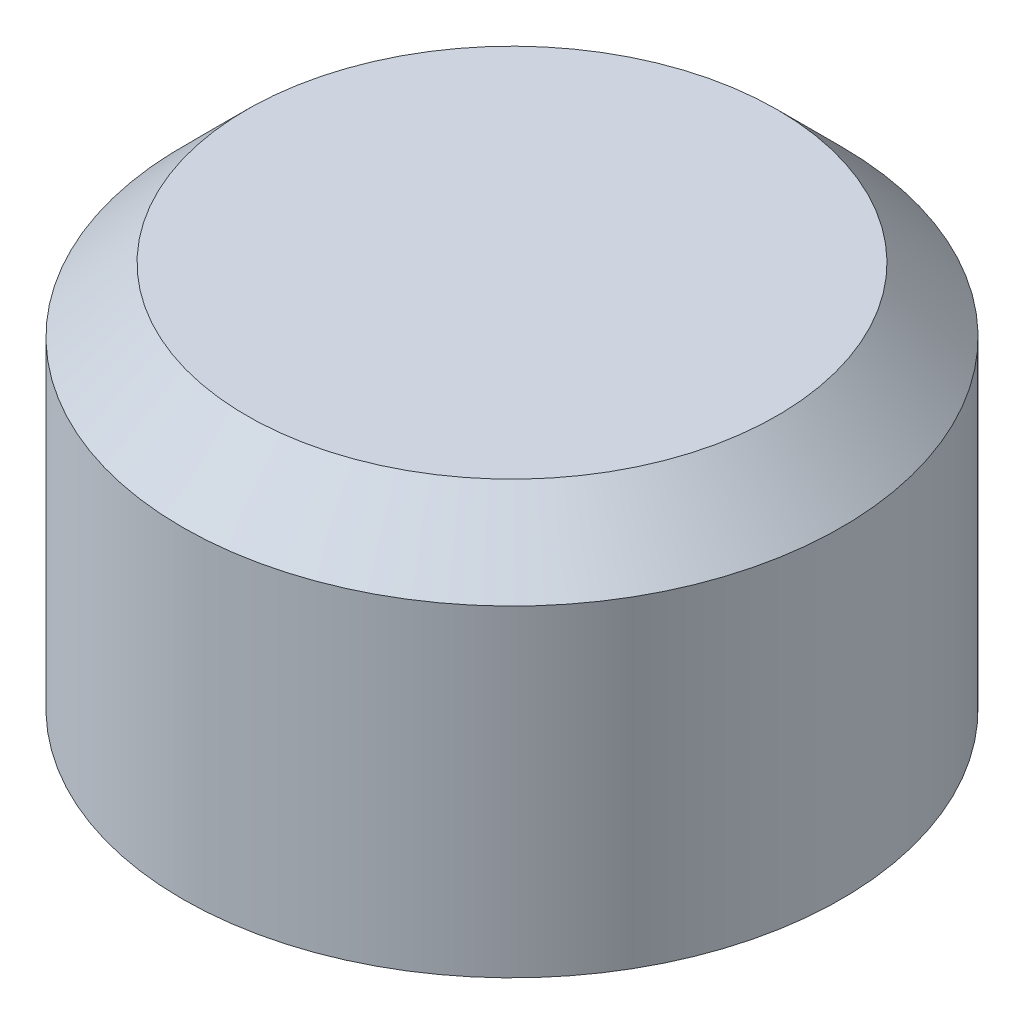
ISO-10303-21;
HEADER;
FILE_DESCRIPTION(('STEP AP214'),'2;1');
FILE_NAME('part.step','',(''),(''),'','','');
FILE_SCHEMA(('AUTOMOTIVE_DESIGN { 1 0 10303 214 1 1 1 1 }'));
ENDSEC;
DATA;
#1=APPLICATION_CONTEXT('core data for automotive mechanical design processes');
#2=APPLICATION_PROTOCOL_DEFINITION('international standard','automotive_design',2000,#1);
#3=PRODUCT_CONTEXT('',#1,'mechanical');
#4=PRODUCT('Part','Part','',(#3));
#5=PRODUCT_RELATED_PRODUCT_CATEGORY('part','',(#4));
#6=PRODUCT_DEFINITION_FORMATION('','',#4);
#7=PRODUCT_DEFINITION_CONTEXT('part definition',#1,'design');
#8=PRODUCT_DEFINITION('design','',#6,#7);
#9=PRODUCT_DEFINITION_SHAPE('','',#8);
#10=(LENGTH_UNIT() NAMED_UNIT(*) SI_UNIT(.MILLI.,.METRE.));
#11=(NAMED_UNIT(*) PLANE_ANGLE_UNIT() SI_UNIT($,.RADIAN.));
#12=(NAMED_UNIT(*) SI_UNIT($,.STERADIAN.) SOLID_ANGLE_UNIT());
#13=UNCERTAINTY_MEASURE_WITH_UNIT(LENGTH_MEASURE(1.E-05),#10,'distance_accuracy_value','');
#14=(GEOMETRIC_REPRESENTATION_CONTEXT(3) GLOBAL_UNCERTAINTY_ASSIGNED_CONTEXT((#13)) GLOBAL_UNIT_ASSIGNED_CONTEXT((#10,
#11,#12)) REPRESENTATION_CONTEXT('',''));
#15=CARTESIAN_POINT('',(0.,0.,0.));
#16=DIRECTION('',(0.,0.,1.));
#17=DIRECTION('',(1.,0.,0.));
#18=AXIS2_PLACEMENT_3D('',#15,#16,#17);
#19=CARTESIAN_POINT('',(0.,7.62,0.));
#20=DIRECTION('',(0.,-1.,0.));
#21=DIRECTION('',(0.,0.,-1.));
#22=AXIS2_PLACEMENT_3D('',#19,#20,#21);
#23=CYLINDRICAL_SURFACE('',#22,6.4999997);
#24=CARTESIAN_POINT('',(0.,6.35000000000001,0.));
#25=DIRECTION('',(0.,1.,0.));
#26=DIRECTION('',(0.,0.,1.));
#27=AXIS2_PLACEMENT_3D('',#24,#25,#26);
#28=CIRCLE('',#27,6.4999997);
#29=CARTESIAN_POINT('',(0.,6.35000000000001,-6.4999997));
#30=VERTEX_POINT('',#29);
#31=EDGE_CURVE('E10',#30,#30,#28,.F.);
#32=CARTESIAN_POINT('',(0.,0.,0.));
#33=DIRECTION('',(0.,1.,0.));
#34=DIRECTION('',(0.,0.,1.));
#35=AXIS2_PLACEMENT_3D('',#32,#33,#34);
#36=CIRCLE('',#35,6.4999997);
#37=CARTESIAN_POINT('',(0.,0.,-6.4999997));
#38=VERTEX_POINT('',#37);
#39=EDGE_CURVE('E42',#38,#38,#36,.T.);
#40=CARTESIAN_POINT('',(0.,6.35000000000001,-6.4999997));
#41=CARTESIAN_POINT('',(0.,6.28385416666667,-6.4999997));
#42=CARTESIAN_POINT('',(0.,6.21770833333334,-6.4999997));
#43=CARTESIAN_POINT('',(0.,6.08541666666667,-6.4999997));
#44=CARTESIAN_POINT('',(0.,6.01927083333334,-6.4999997));
#45=CARTESIAN_POINT('',(0.,5.88697916666667,-6.4999997));
#46=CARTESIAN_POINT('',(0.,5.82083333333334,-6.4999997));
#47=CARTESIAN_POINT('',(0.,5.68854166666667,-6.4999997));
#48=CARTESIAN_POINT('',(0.,5.62239583333334,-6.4999997));
#49=CARTESIAN_POINT('',(0.,5.49010416666667,-6.4999997));
#50=CARTESIAN_POINT('',(0.,5.42395833333334,-6.4999997));
#51=CARTESIAN_POINT('',(0.,5.29166666666667,-6.4999997));
#52=CARTESIAN_POINT('',(0.,5.22552083333334,-6.4999997));
#53=CARTESIAN_POINT('',(0.,5.09322916666667,-6.4999997));
#54=CARTESIAN_POINT('',(0.,5.02708333333334,-6.4999997));
#55=CARTESIAN_POINT('',(0.,4.89479166666667,-6.4999997));
#56=CARTESIAN_POINT('',(0.,4.82864583333334,-6.4999997));
#57=CARTESIAN_POINT('',(0.,4.69635416666667,-6.4999997));
#58=CARTESIAN_POINT('',(0.,4.63020833333334,-6.4999997));
#59=CARTESIAN_POINT('',(0.,4.49791666666667,-6.4999997));
#60=CARTESIAN_POINT('',(0.,4.43177083333334,-6.4999997));
#61=CARTESIAN_POINT('',(0.,4.29947916666667,-6.4999997));
#62=CARTESIAN_POINT('',(0.,4.23333333333334,-6.4999997));
#63=CARTESIAN_POINT('',(0.,4.10104166666667,-6.4999997));
#64=CARTESIAN_POINT('',(0.,4.03489583333334,-6.4999997));
#65=CARTESIAN_POINT('',(0.,3.90260416666667,-6.4999997));
#66=CARTESIAN_POINT('',(0.,3.83645833333334,-6.4999997));
#67=CARTESIAN_POINT('',(0.,3.70416666666667,-6.4999997));
#68=CARTESIAN_POINT('',(0.,3.63802083333334,-6.4999997));
#69=CARTESIAN_POINT('',(0.,3.50572916666667,-6.4999997));
#70=CARTESIAN_POINT('',(0.,3.43958333333334,-6.4999997));
#71=CARTESIAN_POINT('',(0.,3.30729166666667,-6.4999997));
#72=CARTESIAN_POINT('',(0.,3.24114583333334,-6.4999997));
#73=CARTESIAN_POINT('',(0.,3.10885416666667,-6.4999997));
#74=CARTESIAN_POINT('',(0.,3.04270833333334,-6.4999997));
#75=CARTESIAN_POINT('',(0.,2.91041666666667,-6.4999997));
#76=CARTESIAN_POINT('',(0.,2.84427083333334,-6.4999997));
#77=CARTESIAN_POINT('',(0.,2.71197916666667,-6.4999997));
#78=CARTESIAN_POINT('',(0.,2.64583333333334,-6.4999997));
#79=CARTESIAN_POINT('',(0.,2.51354166666667,-6.4999997));
#80=CARTESIAN_POINT('',(0.,2.44739583333334,-6.4999997));
#81=CARTESIAN_POINT('',(0.,2.31510416666667,-6.4999997));
#82=CARTESIAN_POINT('',(0.,2.24895833333334,-6.4999997));
#83=CARTESIAN_POINT('',(0.,2.11666666666667,-6.4999997));
#84=CARTESIAN_POINT('',(0.,2.05052083333334,-6.4999997));
#85=CARTESIAN_POINT('',(0.,1.91822916666667,-6.4999997));
#86=CARTESIAN_POINT('',(0.,1.85208333333334,-6.4999997));
#87=CARTESIAN_POINT('',(0.,1.71979166666667,-6.4999997));
#88=CARTESIAN_POINT('',(0.,1.65364583333334,-6.4999997));
#89=CARTESIAN_POINT('',(0.,1.52135416666667,-6.4999997));
#90=CARTESIAN_POINT('',(0.,1.45520833333333,-6.4999997));
#91=CARTESIAN_POINT('',(0.,1.32291666666667,-6.4999997));
#92=CARTESIAN_POINT('',(0.,1.25677083333333,-6.4999997));
#93=CARTESIAN_POINT('',(0.,1.12447916666667,-6.4999997));
#94=CARTESIAN_POINT('',(0.,1.05833333333333,-6.4999997));
#95=CARTESIAN_POINT('',(0.,0.926041666666668,-6.4999997));
#96=CARTESIAN_POINT('',(0.,0.859895833333335,-6.4999997));
#97=CARTESIAN_POINT('',(0.,0.727604166666667,-6.4999997));
#98=CARTESIAN_POINT('',(0.,0.661458333333334,-6.4999997));
#99=CARTESIAN_POINT('',(0.,0.529166666666667,-6.4999997));
#100=CARTESIAN_POINT('',(0.,0.463020833333333,-6.4999997));
#101=CARTESIAN_POINT('',(0.,0.330729166666667,-6.4999997));
#102=CARTESIAN_POINT('',(0.,0.264583333333334,-6.4999997));
#103=CARTESIAN_POINT('',(0.,0.132291666666667,-6.4999997));
#104=CARTESIAN_POINT('',(0.,0.0661458333333335,-6.4999997));
#105=CARTESIAN_POINT('',(0.,0.,-6.4999997));
#106=B_SPLINE_CURVE_WITH_KNOTS('',3,(#40,#41,#42,#43,#44,#45,#46,#47,#48,#49,#50,#51,#52,#53,
#54,#55,#56,#57,#58,#59,#60,#61,#62,#63,#64,#65,#66,#67,#68,#69,#70,#71,#72,#73,#74,#75,#76,#77,
#78,#79,#80,#81,#82,#83,#84,#85,#86,#87,#88,#89,#90,#91,#92,#93,#94,#95,#96,#97,#98,#99,#100,
#101,#102,#103,#104,#105),.UNSPECIFIED.,.F.,.F.,(4,2,2,2,2,2,2,2,2,2,2,2,2,2,2,2,2,2,2,2,2,2,2,
2,2,2,2,2,2,2,2,2,4),(0.,0.198437500000001,0.396875000000001,0.595312500000001,
0.793750000000001,0.992187500000001,1.190625,1.3890625,1.5875,1.7859375,1.984375,2.1828125,
2.38125,2.5796875,2.778125,2.9765625,3.175,3.3734375,3.571875,3.7703125,3.96875,
4.16718750000001,4.36562500000001,4.5640625,4.76250000000001,4.96093750000001,5.15937500000001,
5.35781250000001,5.55625000000001,5.75468750000001,5.95312500000001,6.15156250000001,
6.35000000000001),.UNSPECIFIED.);
#107=EDGE_CURVE('BSEAM31',#30,#38,#106,.T.);
#108=ORIENTED_EDGE('',*,*,#31,.T.);
#109=ORIENTED_EDGE('',*,*,#39,.T.);
#110=ORIENTED_EDGE('',*,*,#107,.T.);
#111=ORIENTED_EDGE('',*,*,#107,.F.);
#112=EDGE_LOOP('',(#108,#110,#109,#111));
#113=FACE_BOUND('',#112,.T.);
#114=ADVANCED_FACE('F31',(#113),#23,.T.);
#115=CARTESIAN_POINT('',(0.,7.62,0.));
#116=DIRECTION('',(0.,1.,0.));
#117=DIRECTION('',(0.,0.,1.));
#118=AXIS2_PLACEMENT_3D('',#115,#116,#117);
#119=PLANE('',#118);
#120=CARTESIAN_POINT('',(0.,7.62,0.));
#121=DIRECTION('',(0.,1.,0.));
#122=DIRECTION('',(0.,0.,1.));
#123=AXIS2_PLACEMENT_3D('',#120,#121,#122);
#124=CIRCLE('',#123,5.22999970000001);
#125=CARTESIAN_POINT('',(0.,7.62,-5.22999970000001));
#126=VERTEX_POINT('',#125);
#127=EDGE_CURVE('E38',#126,#126,#124,.T.);
#128=ORIENTED_EDGE('',*,*,#127,.T.);
#129=EDGE_LOOP('',(#128));
#130=FACE_BOUND('',#129,.T.);
#131=ADVANCED_FACE('F52',(#130),#119,.T.);
#132=CARTESIAN_POINT('',(0.,0.,0.));
#133=DIRECTION('',(0.,1.,0.));
#134=DIRECTION('',(0.,0.,1.));
#135=AXIS2_PLACEMENT_3D('',#132,#133,#134);
#136=PLANE('',#135);
#137=ORIENTED_EDGE('',*,*,#39,.F.);
#138=EDGE_LOOP('',(#137));
#139=FACE_BOUND('',#138,.T.);
#140=ADVANCED_FACE('F50',(#139),#136,.F.);
#141=CARTESIAN_POINT('',(0.,7.62,0.));
#142=DIRECTION('',(0.,-1.,0.));
#143=DIRECTION('',(0.,0.,-1.));
#144=AXIS2_PLACEMENT_3D('',#141,#142,#143);
#145=CONICAL_SURFACE('',#144,5.22999970000001,0.785398163397448);
#146=CARTESIAN_POINT('',(0.,6.35000000000001,-6.4999997));
#147=CARTESIAN_POINT('',(0.,6.36322916666667,-6.48677053333333));
#148=CARTESIAN_POINT('',(0.,6.37645833333334,-6.47354136666667));
#149=CARTESIAN_POINT('',(0.,6.40291666666667,-6.44708303333334));
#150=CARTESIAN_POINT('',(0.,6.41614583333334,-6.43385386666667));
#151=CARTESIAN_POINT('',(0.,6.44260416666667,-6.40739553333334));
#152=CARTESIAN_POINT('',(0.,6.45583333333334,-6.39416636666667));
#153=CARTESIAN_POINT('',(0.,6.48229166666667,-6.36770803333334));
#154=CARTESIAN_POINT('',(0.,6.49552083333334,-6.35447886666667));
#155=CARTESIAN_POINT('',(0.,6.52197916666667,-6.32802053333334));
#156=CARTESIAN_POINT('',(0.,6.53520833333334,-6.31479136666667));
#157=CARTESIAN_POINT('',(0.,6.56166666666667,-6.28833303333334));
#158=CARTESIAN_POINT('',(0.,6.57489583333334,-6.27510386666667));
#159=CARTESIAN_POINT('',(0.,6.60135416666667,-6.24864553333334));
#160=CARTESIAN_POINT('',(0.,6.61458333333334,-6.23541636666667));
#161=CARTESIAN_POINT('',(0.,6.64104166666667,-6.20895803333334));
#162=CARTESIAN_POINT('',(0.,6.65427083333334,-6.19572886666667));
#163=CARTESIAN_POINT('',(0.,6.68072916666667,-6.16927053333334));
#164=CARTESIAN_POINT('',(0.,6.69395833333334,-6.15604136666667));
#165=CARTESIAN_POINT('',(0.,6.72041666666667,-6.12958303333334));
#166=CARTESIAN_POINT('',(0.,6.73364583333334,-6.11635386666667));
#167=CARTESIAN_POINT('',(0.,6.76010416666667,-6.08989553333334));
#168=CARTESIAN_POINT('',(0.,6.77333333333334,-6.07666636666667));
#169=CARTESIAN_POINT('',(0.,6.79979166666667,-6.05020803333334));
#170=CARTESIAN_POINT('',(0.,6.81302083333334,-6.03697886666667));
#171=CARTESIAN_POINT('',(0.,6.83947916666667,-6.01052053333334));
#172=CARTESIAN_POINT('',(0.,6.85270833333334,-5.99729136666667));
#173=CARTESIAN_POINT('',(0.,6.87916666666667,-5.97083303333334));
#174=CARTESIAN_POINT('',(0.,6.89239583333334,-5.95760386666667));
#175=CARTESIAN_POINT('',(0.,6.91885416666667,-5.93114553333334));
#176=CARTESIAN_POINT('',(0.,6.93208333333334,-5.91791636666667));
#177=CARTESIAN_POINT('',(0.,6.95854166666667,-5.89145803333334));
#178=CARTESIAN_POINT('',(0.,6.97177083333334,-5.87822886666667));
#179=CARTESIAN_POINT('',(0.,6.99822916666667,-5.85177053333334));
#180=CARTESIAN_POINT('',(0.,7.01145833333334,-5.83854136666667));
#181=CARTESIAN_POINT('',(0.,7.03791666666667,-5.81208303333334));
#182=CARTESIAN_POINT('',(0.,7.05114583333334,-5.79885386666667));
#183=CARTESIAN_POINT('',(0.,7.07760416666667,-5.77239553333334));
#184=CARTESIAN_POINT('',(0.,7.09083333333334,-5.75916636666667));
#185=CARTESIAN_POINT('',(0.,7.11729166666667,-5.73270803333334));
#186=CARTESIAN_POINT('',(0.,7.13052083333334,-5.71947886666667));
#187=CARTESIAN_POINT('',(0.,7.15697916666667,-5.69302053333334));
#188=CARTESIAN_POINT('',(0.,7.17020833333333,-5.67979136666667));
#189=CARTESIAN_POINT('',(0.,7.19666666666667,-5.65333303333334));
#190=CARTESIAN_POINT('',(0.,7.20989583333333,-5.64010386666667));
#191=CARTESIAN_POINT('',(0.,7.23635416666667,-5.61364553333334));
#192=CARTESIAN_POINT('',(0.,7.24958333333333,-5.60041636666667));
#193=CARTESIAN_POINT('',(0.,7.27604166666667,-5.57395803333334));
#194=CARTESIAN_POINT('',(0.,7.28927083333333,-5.56072886666668));
#195=CARTESIAN_POINT('',(0.,7.31572916666667,-5.53427053333334));
#196=CARTESIAN_POINT('',(0.,7.32895833333333,-5.52104136666668));
#197=CARTESIAN_POINT('',(0.,7.35541666666667,-5.49458303333334));
#198=CARTESIAN_POINT('',(0.,7.36864583333333,-5.48135386666668));
#199=CARTESIAN_POINT('',(0.,7.39510416666667,-5.45489553333334));
#200=CARTESIAN_POINT('',(0.,7.40833333333333,-5.44166636666668));
#201=CARTESIAN_POINT('',(0.,7.43479166666667,-5.41520803333334));
#202=CARTESIAN_POINT('',(0.,7.44802083333333,-5.40197886666668));
#203=CARTESIAN_POINT('',(0.,7.47447916666667,-5.37552053333334));
#204=CARTESIAN_POINT('',(0.,7.48770833333333,-5.36229136666668));
#205=CARTESIAN_POINT('',(0.,7.51416666666667,-5.33583303333334));
#206=CARTESIAN_POINT('',(0.,7.52739583333333,-5.32260386666668));
#207=CARTESIAN_POINT('',(0.,7.55385416666667,-5.29614553333334));
#208=CARTESIAN_POINT('',(0.,7.56708333333333,-5.28291636666668));
#209=CARTESIAN_POINT('',(0.,7.59354166666667,-5.25645803333334));
#210=CARTESIAN_POINT('',(0.,7.60677083333333,-5.24322886666668));
#211=CARTESIAN_POINT('',(0.,7.62,-5.22999970000001));
#212=B_SPLINE_CURVE_WITH_KNOTS('',3,(#146,#147,#148,#149,#150,#151,#152,#153,#154,#155,#156,
#157,#158,#159,#160,#161,#162,#163,#164,#165,#166,#167,#168,#169,#170,#171,#172,#173,#174,#175,
#176,#177,#178,#179,#180,#181,#182,#183,#184,#185,#186,#187,#188,#189,#190,#191,#192,#193,#194,
#195,#196,#197,#198,#199,#200,#201,#202,#203,#204,#205,#206,#207,#208,#209,#210,#211),
.UNSPECIFIED.,.F.,.F.,(4,2,2,2,2,2,2,2,2,2,2,2,2,2,2,2,2,2,2,2,2,2,2,2,2,2,2,2,2,2,2,2,4),(0.,
0.0561266007566819,0.112253201513364,0.168379802270045,0.224506403026727,0.280633003783409,
0.336759604540091,0.392886205296773,0.449012806053455,0.505139406810137,0.561266007566819,
0.6173926083235,0.673519209080182,0.729645809836864,0.785772410593546,0.841899011350227,
0.898025612106909,0.954152212863591,1.01027881362027,1.06640541437695,1.12253201513364,
1.17865861589032,1.234785216647,1.29091181740368,1.34703841816036,1.40316501891705,
1.45929161967373,1.51541822043041,1.57154482118709,1.62767142194377,1.68379802270045,
1.73992462345714,1.79605122421382),.UNSPECIFIED.);
#213=EDGE_CURVE('BSEAM33',#30,#126,#212,.T.);
#214=ORIENTED_EDGE('',*,*,#31,.F.);
#215=ORIENTED_EDGE('',*,*,#127,.F.);
#216=ORIENTED_EDGE('',*,*,#213,.T.);
#217=ORIENTED_EDGE('',*,*,#213,.F.);
#218=EDGE_LOOP('',(#214,#216,#215,#217));
#219=FACE_BOUND('',#218,.T.);
#220=ADVANCED_FACE('F33',(#219),#145,.T.);
#221=CLOSED_SHELL('',(#114,#131,#140,#220));
#222=MANIFOLD_SOLID_BREP('B2',#221);
#223=ADVANCED_BREP_SHAPE_REPRESENTATION('',(#18,#222),#14);
#224=SHAPE_DEFINITION_REPRESENTATION(#9,#223);
ENDSEC;
END-ISO-10303-21;
